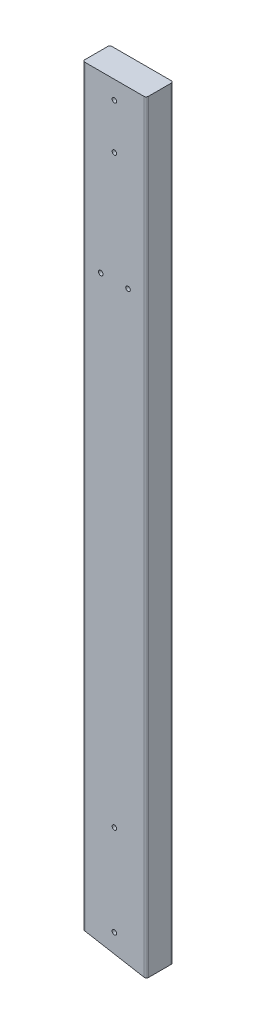
ISO-10303-21;
HEADER;
FILE_DESCRIPTION(('STEP AP214'),'2;1');
FILE_NAME('part.step','',(''),(''),'','','');
FILE_SCHEMA(('AUTOMOTIVE_DESIGN { 1 0 10303 214 1 1 1 1 }'));
ENDSEC;
DATA;
#1=APPLICATION_CONTEXT('core data for automotive mechanical design processes');
#2=APPLICATION_PROTOCOL_DEFINITION('international standard','automotive_design',2000,#1);
#3=PRODUCT_CONTEXT('',#1,'mechanical');
#4=PRODUCT('Part','Part','',(#3));
#5=PRODUCT_RELATED_PRODUCT_CATEGORY('part','',(#4));
#6=PRODUCT_DEFINITION_FORMATION('','',#4);
#7=PRODUCT_DEFINITION_CONTEXT('part definition',#1,'design');
#8=PRODUCT_DEFINITION('design','',#6,#7);
#9=PRODUCT_DEFINITION_SHAPE('','',#8);
#10=(LENGTH_UNIT() NAMED_UNIT(*) SI_UNIT(.MILLI.,.METRE.));
#11=(NAMED_UNIT(*) PLANE_ANGLE_UNIT() SI_UNIT($,.RADIAN.));
#12=(NAMED_UNIT(*) SI_UNIT($,.STERADIAN.) SOLID_ANGLE_UNIT());
#13=UNCERTAINTY_MEASURE_WITH_UNIT(LENGTH_MEASURE(1.E-05),#10,'distance_accuracy_value','');
#14=(GEOMETRIC_REPRESENTATION_CONTEXT(3) GLOBAL_UNCERTAINTY_ASSIGNED_CONTEXT((#13)) GLOBAL_UNIT_ASSIGNED_CONTEXT((#10,
#11,#12)) REPRESENTATION_CONTEXT('',''));
#15=CARTESIAN_POINT('',(0.,0.,0.));
#16=DIRECTION('',(0.,0.,1.));
#17=DIRECTION('',(1.,0.,0.));
#18=AXIS2_PLACEMENT_3D('',#15,#16,#17);
#19=CARTESIAN_POINT('',(-44.45,1068.3875,-19.05));
#20=DIRECTION('',(1.,0.,0.));
#21=DIRECTION('',(0.,0.,-1.));
#22=AXIS2_PLACEMENT_3D('',#19,#20,#21);
#23=PLANE('',#22);
#24=DIRECTION('',(0.,0.,1.));
#25=VECTOR('',#24,1.);
#26=CARTESIAN_POINT('',(-44.45,1068.3875,-19.05));
#27=LINE('',#26,#25);
#28=CARTESIAN_POINT('',(-44.45,1068.3875,-15.875));
#29=VERTEX_POINT('',#28);
#30=CARTESIAN_POINT('',(-44.45,1068.3875,15.875));
#31=VERTEX_POINT('',#30);
#32=EDGE_CURVE('E121',#29,#31,#27,.T.);
#33=ORIENTED_EDGE('',*,*,#32,.F.);
#34=DIRECTION('',(0.,-1.,0.));
#35=VECTOR('',#34,1.);
#36=CARTESIAN_POINT('',(-44.45,1068.3875,-15.875));
#37=LINE('',#36,#35);
#38=CARTESIAN_POINT('',(-44.45,15.6754685849818,-15.8750000000001));
#39=VERTEX_POINT('',#38);
#40=EDGE_CURVE('E106',#29,#39,#37,.T.);
#41=ORIENTED_EDGE('',*,*,#40,.T.);
#42=DIRECTION('',(0.,0.,1.));
#43=VECTOR('',#42,1.);
#44=CARTESIAN_POINT('',(-44.45,15.6754685849818,-1238.5867532));
#45=LINE('',#44,#43);
#46=CARTESIAN_POINT('',(-44.45,15.6754685849818,15.8750000000001));
#47=VERTEX_POINT('',#46);
#48=EDGE_CURVE('E118',#39,#47,#45,.T.);
#49=ORIENTED_EDGE('',*,*,#48,.T.);
#50=DIRECTION('',(0.,-1.,0.));
#51=VECTOR('',#50,1.);
#52=CARTESIAN_POINT('',(-44.45,1068.3875,15.875));
#53=LINE('',#52,#51);
#54=EDGE_CURVE('E123',#47,#31,#53,.F.);
#55=ORIENTED_EDGE('',*,*,#54,.T.);
#56=EDGE_LOOP('',(#33,#41,#49,#55));
#57=FACE_BOUND('',#56,.T.);
#58=ADVANCED_FACE('F37',(#57),#23,.F.);
#59=CARTESIAN_POINT('',(44.45,1068.3875,19.05));
#60=DIRECTION('',(0.,0.,-1.));
#61=DIRECTION('',(-1.,0.,0.));
#62=AXIS2_PLACEMENT_3D('',#59,#60,#61);
#63=PLANE('',#62);
#64=CARTESIAN_POINT('',(0.,34.225276482,19.05));
#65=DIRECTION('',(0.,0.,1.));
#66=DIRECTION('',(1.,0.,0.));
#67=AXIS2_PLACEMENT_3D('',#64,#65,#66);
#68=CIRCLE('',#67,3.17499999999999);
#69=CARTESIAN_POINT('',(3.17499999999999,34.225276482,19.05));
#70=VERTEX_POINT('',#69);
#71=EDGE_CURVE('E369',#70,#70,#68,.T.);
#72=ORIENTED_EDGE('',*,*,#71,.F.);
#73=EDGE_LOOP('',(#72));
#74=FACE_BOUND('',#73,.T.);
#75=CARTESIAN_POINT('',(0.,161.225276482,19.05));
#76=DIRECTION('',(0.,0.,1.));
#77=DIRECTION('',(1.,0.,0.));
#78=AXIS2_PLACEMENT_3D('',#75,#76,#77);
#79=CIRCLE('',#78,3.17499999999999);
#80=CARTESIAN_POINT('',(3.17499999999999,161.225276482,19.05));
#81=VERTEX_POINT('',#80);
#82=EDGE_CURVE('E365',#81,#81,#79,.T.);
#83=ORIENTED_EDGE('',*,*,#82,.F.);
#84=EDGE_LOOP('',(#83));
#85=FACE_BOUND('',#84,.T.);
#86=CARTESIAN_POINT('',(19.05,823.9779812,19.05));
#87=DIRECTION('',(0.,0.,1.));
#88=DIRECTION('',(1.,0.,0.));
#89=AXIS2_PLACEMENT_3D('',#86,#87,#88);
#90=CIRCLE('',#89,3.17499999999999);
#91=CARTESIAN_POINT('',(22.225,823.9779812,19.05));
#92=VERTEX_POINT('',#91);
#93=EDGE_CURVE('E361',#92,#92,#90,.T.);
#94=ORIENTED_EDGE('',*,*,#93,.F.);
#95=EDGE_LOOP('',(#94));
#96=FACE_BOUND('',#95,.T.);
#97=CARTESIAN_POINT('',(-19.05,823.9779812,19.05));
#98=DIRECTION('',(0.,0.,1.));
#99=DIRECTION('',(1.,0.,0.));
#100=AXIS2_PLACEMENT_3D('',#97,#98,#99);
#101=CIRCLE('',#100,3.17499999999999);
#102=CARTESIAN_POINT('',(-15.875,823.9779812,19.05));
#103=VERTEX_POINT('',#102);
#104=EDGE_CURVE('E357',#103,#103,#101,.T.);
#105=ORIENTED_EDGE('',*,*,#104,.F.);
#106=EDGE_LOOP('',(#105));
#107=FACE_BOUND('',#106,.T.);
#108=CARTESIAN_POINT('',(0.,979.4875,19.05));
#109=DIRECTION('',(0.,0.,1.));
#110=DIRECTION('',(1.,0.,0.));
#111=AXIS2_PLACEMENT_3D('',#108,#109,#110);
#112=CIRCLE('',#111,3.17499999999999);
#113=CARTESIAN_POINT('',(3.17499999999999,979.4875,19.05));
#114=VERTEX_POINT('',#113);
#115=EDGE_CURVE('E353',#114,#114,#112,.T.);
#116=ORIENTED_EDGE('',*,*,#115,.F.);
#117=EDGE_LOOP('',(#116));
#118=FACE_BOUND('',#117,.T.);
#119=CARTESIAN_POINT('',(0.,1042.9875,19.05));
#120=DIRECTION('',(0.,0.,1.));
#121=DIRECTION('',(1.,0.,0.));
#122=AXIS2_PLACEMENT_3D('',#119,#120,#121);
#123=CIRCLE('',#122,3.17499999999999);
#124=CARTESIAN_POINT('',(3.17499999999999,1042.9875,19.05));
#125=VERTEX_POINT('',#124);
#126=EDGE_CURVE('E348',#125,#125,#123,.T.);
#127=ORIENTED_EDGE('',*,*,#126,.F.);
#128=EDGE_LOOP('',(#127));
#129=FACE_BOUND('',#128,.T.);
#130=DIRECTION('',(1.,0.,0.));
#131=VECTOR('',#130,1.);
#132=CARTESIAN_POINT('',(44.45,1068.3875,19.05));
#133=LINE('',#132,#131);
#134=CARTESIAN_POINT('',(-41.275,1068.3875,19.05));
#135=VERTEX_POINT('',#134);
#136=CARTESIAN_POINT('',(41.275,1068.3875,19.05));
#137=VERTEX_POINT('',#136);
#138=EDGE_CURVE('E137',#135,#137,#133,.T.);
#139=ORIENTED_EDGE('',*,*,#138,.F.);
#140=DIRECTION('',(0.,-1.,0.));
#141=VECTOR('',#140,1.);
#142=CARTESIAN_POINT('',(-41.275,1068.3875,19.05));
#143=LINE('',#142,#141);
#144=CARTESIAN_POINT('',(-41.275,15.1156304212325,19.05));
#145=VERTEX_POINT('',#144);
#146=EDGE_CURVE('E162',#135,#145,#143,.T.);
#147=ORIENTED_EDGE('',*,*,#146,.T.);
#148=DIRECTION('',(-0.984807753012209,0.173648177666923,0.));
#149=VECTOR('',#148,1.);
#150=CARTESIAN_POINT('',(44.45,0.,19.05));
#151=LINE('',#150,#149);
#152=CARTESIAN_POINT('',(41.275,0.55983816374935,19.05));
#153=VERTEX_POINT('',#152);
#154=EDGE_CURVE('E128',#153,#145,#151,.T.);
#155=ORIENTED_EDGE('',*,*,#154,.F.);
#156=DIRECTION('',(0.,-1.,0.));
#157=VECTOR('',#156,1.);
#158=CARTESIAN_POINT('',(41.275,1068.3875,19.05));
#159=LINE('',#158,#157);
#160=EDGE_CURVE('E160',#153,#137,#159,.F.);
#161=ORIENTED_EDGE('',*,*,#160,.T.);
#162=EDGE_LOOP('',(#139,#147,#155,#161));
#163=FACE_BOUND('',#162,.T.);
#164=ADVANCED_FACE('F184',(#74,#85,#96,#107,#118,#129,#163),#63,.F.);
#165=CARTESIAN_POINT('',(44.45,1068.3875,-19.05));
#166=DIRECTION('',(-1.,0.,0.));
#167=DIRECTION('',(0.,0.,1.));
#168=AXIS2_PLACEMENT_3D('',#165,#166,#167);
#169=PLANE('',#168);
#170=DIRECTION('',(0.,0.,-1.));
#171=VECTOR('',#170,1.);
#172=CARTESIAN_POINT('',(44.45,0.,-19.05));
#173=LINE('',#172,#171);
#174=CARTESIAN_POINT('',(44.45,0.,15.875));
#175=VERTEX_POINT('',#174);
#176=CARTESIAN_POINT('',(44.45,0.,-15.875));
#177=VERTEX_POINT('',#176);
#178=EDGE_CURVE('E130',#175,#177,#173,.T.);
#179=ORIENTED_EDGE('',*,*,#178,.T.);
#180=DIRECTION('',(0.,-1.,0.));
#181=VECTOR('',#180,1.);
#182=CARTESIAN_POINT('',(44.45,1068.3875,-15.875));
#183=LINE('',#182,#181);
#184=CARTESIAN_POINT('',(44.45,1068.3875,-15.875));
#185=VERTEX_POINT('',#184);
#186=EDGE_CURVE('E11',#177,#185,#183,.F.);
#187=ORIENTED_EDGE('',*,*,#186,.T.);
#188=DIRECTION('',(0.,0.,-1.));
#189=VECTOR('',#188,1.);
#190=CARTESIAN_POINT('',(44.45,1068.3875,-19.05));
#191=LINE('',#190,#189);
#192=CARTESIAN_POINT('',(44.45,1068.3875,15.875));
#193=VERTEX_POINT('',#192);
#194=EDGE_CURVE('E139',#193,#185,#191,.T.);
#195=ORIENTED_EDGE('',*,*,#194,.F.);
#196=DIRECTION('',(0.,-1.,0.));
#197=VECTOR('',#196,1.);
#198=CARTESIAN_POINT('',(44.45,1068.3875,15.875));
#199=LINE('',#198,#197);
#200=EDGE_CURVE('E45',#193,#175,#199,.T.);
#201=ORIENTED_EDGE('',*,*,#200,.T.);
#202=EDGE_LOOP('',(#179,#187,#195,#201));
#203=FACE_BOUND('',#202,.T.);
#204=ADVANCED_FACE('F167',(#203),#169,.F.);
#205=CARTESIAN_POINT('',(44.45,1068.3875,-19.05));
#206=DIRECTION('',(0.,0.,1.));
#207=DIRECTION('',(1.,0.,0.));
#208=AXIS2_PLACEMENT_3D('',#205,#206,#207);
#209=PLANE('',#208);
#210=CARTESIAN_POINT('',(0.,34.225276482,-19.05));
#211=DIRECTION('',(0.,0.,1.));
#212=DIRECTION('',(1.,0.,0.));
#213=AXIS2_PLACEMENT_3D('',#210,#211,#212);
#214=CIRCLE('',#213,3.17499999999998);
#215=CARTESIAN_POINT('',(3.17499999999999,34.225276482,-19.05));
#216=VERTEX_POINT('',#215);
#217=EDGE_CURVE('E329',#216,#216,#214,.T.);
#218=ORIENTED_EDGE('',*,*,#217,.T.);
#219=EDGE_LOOP('',(#218));
#220=FACE_BOUND('',#219,.T.);
#221=CARTESIAN_POINT('',(0.,161.225276482,-19.05));
#222=DIRECTION('',(0.,0.,1.));
#223=DIRECTION('',(1.,0.,0.));
#224=AXIS2_PLACEMENT_3D('',#221,#222,#223);
#225=CIRCLE('',#224,3.17499999999998);
#226=CARTESIAN_POINT('',(3.17499999999999,161.225276482,-19.05));
#227=VERTEX_POINT('',#226);
#228=EDGE_CURVE('E333',#227,#227,#225,.T.);
#229=ORIENTED_EDGE('',*,*,#228,.T.);
#230=EDGE_LOOP('',(#229));
#231=FACE_BOUND('',#230,.T.);
#232=CARTESIAN_POINT('',(19.05,823.9779812,-19.05));
#233=DIRECTION('',(0.,0.,1.));
#234=DIRECTION('',(1.,0.,0.));
#235=AXIS2_PLACEMENT_3D('',#232,#233,#234);
#236=CIRCLE('',#235,3.17499999999998);
#237=CARTESIAN_POINT('',(22.225,823.9779812,-19.05));
#238=VERTEX_POINT('',#237);
#239=EDGE_CURVE('E337',#238,#238,#236,.T.);
#240=ORIENTED_EDGE('',*,*,#239,.T.);
#241=EDGE_LOOP('',(#240));
#242=FACE_BOUND('',#241,.T.);
#243=CARTESIAN_POINT('',(-19.05,823.9779812,-19.05));
#244=DIRECTION('',(0.,0.,1.));
#245=DIRECTION('',(1.,0.,0.));
#246=AXIS2_PLACEMENT_3D('',#243,#244,#245);
#247=CIRCLE('',#246,3.17499999999998);
#248=CARTESIAN_POINT('',(-15.875,823.9779812,-19.05));
#249=VERTEX_POINT('',#248);
#250=EDGE_CURVE('E341',#249,#249,#247,.T.);
#251=ORIENTED_EDGE('',*,*,#250,.T.);
#252=EDGE_LOOP('',(#251));
#253=FACE_BOUND('',#252,.T.);
#254=CARTESIAN_POINT('',(0.,979.4875,-19.05));
#255=DIRECTION('',(0.,0.,1.));
#256=DIRECTION('',(1.,0.,0.));
#257=AXIS2_PLACEMENT_3D('',#254,#255,#256);
#258=CIRCLE('',#257,3.17499999999998);
#259=CARTESIAN_POINT('',(3.17499999999999,979.4875,-19.05));
#260=VERTEX_POINT('',#259);
#261=EDGE_CURVE('E345',#260,#260,#258,.T.);
#262=ORIENTED_EDGE('',*,*,#261,.T.);
#263=EDGE_LOOP('',(#262));
#264=FACE_BOUND('',#263,.T.);
#265=CARTESIAN_POINT('',(0.,1042.9875,-19.05));
#266=DIRECTION('',(0.,0.,1.));
#267=DIRECTION('',(1.,0.,0.));
#268=AXIS2_PLACEMENT_3D('',#265,#266,#267);
#269=CIRCLE('',#268,3.17499999999998);
#270=CARTESIAN_POINT('',(3.17499999999999,1042.9875,-19.05));
#271=VERTEX_POINT('',#270);
#272=EDGE_CURVE('E132',#271,#271,#269,.T.);
#273=ORIENTED_EDGE('',*,*,#272,.T.);
#274=EDGE_LOOP('',(#273));
#275=FACE_BOUND('',#274,.T.);
#276=DIRECTION('',(-0.984807753012209,0.173648177666923,0.));
#277=VECTOR('',#276,1.);
#278=CARTESIAN_POINT('',(-138.255022938669,32.2158250550446,-19.05));
#279=LINE('',#278,#277);
#280=CARTESIAN_POINT('',(41.275,0.559838163749188,-19.05));
#281=VERTEX_POINT('',#280);
#282=CARTESIAN_POINT('',(-41.275,15.1156304212323,-19.05));
#283=VERTEX_POINT('',#282);
#284=EDGE_CURVE('E127',#281,#283,#279,.T.);
#285=ORIENTED_EDGE('',*,*,#284,.T.);
#286=DIRECTION('',(0.,-1.,0.));
#287=VECTOR('',#286,1.);
#288=CARTESIAN_POINT('',(-41.275,1068.3875,-19.05));
#289=LINE('',#288,#287);
#290=CARTESIAN_POINT('',(-41.275,1068.3875,-19.05));
#291=VERTEX_POINT('',#290);
#292=EDGE_CURVE('E107',#283,#291,#289,.F.);
#293=ORIENTED_EDGE('',*,*,#292,.T.);
#294=DIRECTION('',(-1.,0.,0.));
#295=VECTOR('',#294,1.);
#296=CARTESIAN_POINT('',(44.45,1068.3875,-19.05));
#297=LINE('',#296,#295);
#298=CARTESIAN_POINT('',(41.275,1068.3875,-19.05));
#299=VERTEX_POINT('',#298);
#300=EDGE_CURVE('E141',#299,#291,#297,.T.);
#301=ORIENTED_EDGE('',*,*,#300,.F.);
#302=DIRECTION('',(0.,-1.,0.));
#303=VECTOR('',#302,1.);
#304=CARTESIAN_POINT('',(41.275,1068.3875,-19.05));
#305=LINE('',#304,#303);
#306=EDGE_CURVE('E112',#299,#281,#305,.T.);
#307=ORIENTED_EDGE('',*,*,#306,.T.);
#308=EDGE_LOOP('',(#285,#293,#301,#307));
#309=FACE_BOUND('',#308,.T.);
#310=ADVANCED_FACE('F176',(#220,#231,#242,#253,#264,#275,#309),#209,.F.);
#311=CARTESIAN_POINT('',(0.,1068.3875,0.));
#312=DIRECTION('',(0.,-1.,0.));
#313=DIRECTION('',(0.,0.,-1.));
#314=AXIS2_PLACEMENT_3D('',#311,#312,#313);
#315=PLANE('',#314);
#316=ORIENTED_EDGE('',*,*,#300,.T.);
#317=CARTESIAN_POINT('',(-41.275,1068.3875,-15.875));
#318=DIRECTION('',(0.,-1.,0.));
#319=DIRECTION('',(0.,0.,-1.));
#320=AXIS2_PLACEMENT_3D('',#317,#318,#319);
#321=CIRCLE('',#320,3.175);
#322=EDGE_CURVE('E158',#291,#29,#321,.F.);
#323=ORIENTED_EDGE('',*,*,#322,.T.);
#324=ORIENTED_EDGE('',*,*,#32,.T.);
#325=CARTESIAN_POINT('',(-41.275,1068.3875,15.875));
#326=DIRECTION('',(0.,-1.,0.));
#327=DIRECTION('',(0.,0.,-1.));
#328=AXIS2_PLACEMENT_3D('',#325,#326,#327);
#329=CIRCLE('',#328,3.175);
#330=EDGE_CURVE('E156',#31,#135,#329,.F.);
#331=ORIENTED_EDGE('',*,*,#330,.T.);
#332=ORIENTED_EDGE('',*,*,#138,.T.);
#333=CARTESIAN_POINT('',(41.275,1068.3875,15.875));
#334=DIRECTION('',(0.,-1.,0.));
#335=DIRECTION('',(0.,0.,-1.));
#336=AXIS2_PLACEMENT_3D('',#333,#334,#335);
#337=CIRCLE('',#336,3.175);
#338=EDGE_CURVE('E57',#137,#193,#337,.F.);
#339=ORIENTED_EDGE('',*,*,#338,.T.);
#340=ORIENTED_EDGE('',*,*,#194,.T.);
#341=CARTESIAN_POINT('',(41.275,1068.3875,-15.875));
#342=DIRECTION('',(0.,-1.,0.));
#343=DIRECTION('',(0.,0.,-1.));
#344=AXIS2_PLACEMENT_3D('',#341,#342,#343);
#345=CIRCLE('',#344,3.175);
#346=EDGE_CURVE('E154',#185,#299,#345,.F.);
#347=ORIENTED_EDGE('',*,*,#346,.T.);
#348=EDGE_LOOP('',(#316,#323,#324,#331,#332,#339,#340,#347));
#349=FACE_BOUND('',#348,.T.);
#350=ADVANCED_FACE('F177',(#349),#315,.F.);
#351=CARTESIAN_POINT('',(44.45,0.,-1238.5867532));
#352=DIRECTION('',(0.173648177666923,0.984807753012209,0.));
#353=DIRECTION('',(-0.984807753012209,0.173648177666923,0.));
#354=AXIS2_PLACEMENT_3D('',#351,#352,#353);
#355=PLANE('',#354);
#356=ORIENTED_EDGE('',*,*,#48,.F.);
#357=CARTESIAN_POINT('',(-41.275,15.1156304212325,-15.875));
#358=DIRECTION('',(0.173648177666923,0.984807753012209,0.));
#359=DIRECTION('',(0.984807753012209,-0.173648177666923,0.));
#360=AXIS2_PLACEMENT_3D('',#357,#358,#359);
#361=ELLIPSE('',#360,3.22397949273724,3.175);
#362=EDGE_CURVE('E102',#39,#283,#361,.F.);
#363=ORIENTED_EDGE('',*,*,#362,.T.);
#364=ORIENTED_EDGE('',*,*,#284,.F.);
#365=CARTESIAN_POINT('',(41.275,0.559838163749271,-15.875));
#366=DIRECTION('',(0.173648177666923,0.984807753012209,0.));
#367=DIRECTION('',(0.984807753012209,-0.173648177666923,0.));
#368=AXIS2_PLACEMENT_3D('',#365,#366,#367);
#369=ELLIPSE('',#368,3.22397949273724,3.175);
#370=EDGE_CURVE('E147',#281,#177,#369,.F.);
#371=ORIENTED_EDGE('',*,*,#370,.T.);
#372=ORIENTED_EDGE('',*,*,#178,.F.);
#373=CARTESIAN_POINT('',(41.275,0.559838163749271,15.875));
#374=DIRECTION('',(0.173648177666923,0.984807753012209,0.));
#375=DIRECTION('',(0.984807753012209,-0.173648177666923,0.));
#376=AXIS2_PLACEMENT_3D('',#373,#374,#375);
#377=ELLIPSE('',#376,3.22397949273724,3.175);
#378=EDGE_CURVE('E122',#175,#153,#377,.F.);
#379=ORIENTED_EDGE('',*,*,#378,.T.);
#380=ORIENTED_EDGE('',*,*,#154,.T.);
#381=CARTESIAN_POINT('',(-41.275,15.1156304212325,15.875));
#382=DIRECTION('',(0.173648177666923,0.984807753012209,0.));
#383=DIRECTION('',(0.984807753012209,-0.173648177666923,0.));
#384=AXIS2_PLACEMENT_3D('',#381,#382,#383);
#385=ELLIPSE('',#384,3.22397949273724,3.175);
#386=EDGE_CURVE('E113',#145,#47,#385,.F.);
#387=ORIENTED_EDGE('',*,*,#386,.T.);
#388=EDGE_LOOP('',(#356,#363,#364,#371,#372,#379,#380,#387));
#389=FACE_BOUND('',#388,.T.);
#390=ADVANCED_FACE('F125',(#389),#355,.F.);
#391=CARTESIAN_POINT('',(0.,1042.9875,19.05));
#392=DIRECTION('',(0.,0.,1.));
#393=DIRECTION('',(1.,0.,0.));
#394=AXIS2_PLACEMENT_3D('',#391,#392,#393);
#395=CYLINDRICAL_SURFACE('',#394,3.17499999999999);
#396=ORIENTED_EDGE('',*,*,#272,.F.);
#397=EDGE_LOOP('',(#396));
#398=FACE_BOUND('',#397,.T.);
#399=ORIENTED_EDGE('',*,*,#126,.T.);
#400=EDGE_LOOP('',(#399));
#401=FACE_BOUND('',#400,.T.);
#402=ADVANCED_FACE('F268',(#398,#401),#395,.F.);
#403=CARTESIAN_POINT('',(0.,979.4875,19.05));
#404=DIRECTION('',(0.,0.,1.));
#405=DIRECTION('',(1.,0.,0.));
#406=AXIS2_PLACEMENT_3D('',#403,#404,#405);
#407=CYLINDRICAL_SURFACE('',#406,3.17499999999999);
#408=ORIENTED_EDGE('',*,*,#261,.F.);
#409=EDGE_LOOP('',(#408));
#410=FACE_BOUND('',#409,.T.);
#411=ORIENTED_EDGE('',*,*,#115,.T.);
#412=EDGE_LOOP('',(#411));
#413=FACE_BOUND('',#412,.T.);
#414=ADVANCED_FACE('F259',(#410,#413),#407,.F.);
#415=CARTESIAN_POINT('',(-19.05,823.9779812,19.05));
#416=DIRECTION('',(0.,0.,1.));
#417=DIRECTION('',(1.,0.,0.));
#418=AXIS2_PLACEMENT_3D('',#415,#416,#417);
#419=CYLINDRICAL_SURFACE('',#418,3.17499999999999);
#420=ORIENTED_EDGE('',*,*,#250,.F.);
#421=EDGE_LOOP('',(#420));
#422=FACE_BOUND('',#421,.T.);
#423=ORIENTED_EDGE('',*,*,#104,.T.);
#424=EDGE_LOOP('',(#423));
#425=FACE_BOUND('',#424,.T.);
#426=ADVANCED_FACE('F250',(#422,#425),#419,.F.);
#427=CARTESIAN_POINT('',(19.05,823.9779812,19.05));
#428=DIRECTION('',(0.,0.,1.));
#429=DIRECTION('',(1.,0.,0.));
#430=AXIS2_PLACEMENT_3D('',#427,#428,#429);
#431=CYLINDRICAL_SURFACE('',#430,3.17499999999999);
#432=ORIENTED_EDGE('',*,*,#239,.F.);
#433=EDGE_LOOP('',(#432));
#434=FACE_BOUND('',#433,.T.);
#435=ORIENTED_EDGE('',*,*,#93,.T.);
#436=EDGE_LOOP('',(#435));
#437=FACE_BOUND('',#436,.T.);
#438=ADVANCED_FACE('F241',(#434,#437),#431,.F.);
#439=CARTESIAN_POINT('',(0.,161.225276482,19.05));
#440=DIRECTION('',(0.,0.,1.));
#441=DIRECTION('',(1.,0.,0.));
#442=AXIS2_PLACEMENT_3D('',#439,#440,#441);
#443=CYLINDRICAL_SURFACE('',#442,3.17499999999999);
#444=ORIENTED_EDGE('',*,*,#228,.F.);
#445=EDGE_LOOP('',(#444));
#446=FACE_BOUND('',#445,.T.);
#447=ORIENTED_EDGE('',*,*,#82,.T.);
#448=EDGE_LOOP('',(#447));
#449=FACE_BOUND('',#448,.T.);
#450=ADVANCED_FACE('F232',(#446,#449),#443,.F.);
#451=CARTESIAN_POINT('',(0.,34.225276482,19.05));
#452=DIRECTION('',(0.,0.,1.));
#453=DIRECTION('',(1.,0.,0.));
#454=AXIS2_PLACEMENT_3D('',#451,#452,#453);
#455=CYLINDRICAL_SURFACE('',#454,3.17499999999999);
#456=ORIENTED_EDGE('',*,*,#217,.F.);
#457=EDGE_LOOP('',(#456));
#458=FACE_BOUND('',#457,.T.);
#459=ORIENTED_EDGE('',*,*,#71,.T.);
#460=EDGE_LOOP('',(#459));
#461=FACE_BOUND('',#460,.T.);
#462=ADVANCED_FACE('F201',(#458,#461),#455,.F.);
#463=CARTESIAN_POINT('',(-41.275,1068.3875,-15.875));
#464=DIRECTION('',(0.,-1.,0.));
#465=DIRECTION('',(0.,0.,-1.));
#466=AXIS2_PLACEMENT_3D('',#463,#464,#465);
#467=CYLINDRICAL_SURFACE('',#466,3.175);
#468=ORIENTED_EDGE('',*,*,#322,.F.);
#469=ORIENTED_EDGE('',*,*,#292,.F.);
#470=ORIENTED_EDGE('',*,*,#362,.F.);
#471=ORIENTED_EDGE('',*,*,#40,.F.);
#472=EDGE_LOOP('',(#468,#469,#470,#471));
#473=FACE_BOUND('',#472,.T.);
#474=ADVANCED_FACE('F105',(#473),#467,.T.);
#475=CARTESIAN_POINT('',(-41.275,1068.3875,15.875));
#476=DIRECTION('',(0.,-1.,0.));
#477=DIRECTION('',(0.,0.,-1.));
#478=AXIS2_PLACEMENT_3D('',#475,#476,#477);
#479=CYLINDRICAL_SURFACE('',#478,3.175);
#480=ORIENTED_EDGE('',*,*,#330,.F.);
#481=ORIENTED_EDGE('',*,*,#54,.F.);
#482=ORIENTED_EDGE('',*,*,#386,.F.);
#483=ORIENTED_EDGE('',*,*,#146,.F.);
#484=EDGE_LOOP('',(#480,#481,#482,#483));
#485=FACE_BOUND('',#484,.T.);
#486=ADVANCED_FACE('F182',(#485),#479,.T.);
#487=CARTESIAN_POINT('',(41.275,1068.3875,-15.875));
#488=DIRECTION('',(0.,-1.,0.));
#489=DIRECTION('',(0.,0.,-1.));
#490=AXIS2_PLACEMENT_3D('',#487,#488,#489);
#491=CYLINDRICAL_SURFACE('',#490,3.175);
#492=ORIENTED_EDGE('',*,*,#346,.F.);
#493=ORIENTED_EDGE('',*,*,#186,.F.);
#494=ORIENTED_EDGE('',*,*,#370,.F.);
#495=ORIENTED_EDGE('',*,*,#306,.F.);
#496=EDGE_LOOP('',(#492,#493,#494,#495));
#497=FACE_BOUND('',#496,.T.);
#498=ADVANCED_FACE('F173',(#497),#491,.T.);
#499=CARTESIAN_POINT('',(41.275,1068.3875,15.875));
#500=DIRECTION('',(0.,-1.,0.));
#501=DIRECTION('',(0.,0.,-1.));
#502=AXIS2_PLACEMENT_3D('',#499,#500,#501);
#503=CYLINDRICAL_SURFACE('',#502,3.175);
#504=ORIENTED_EDGE('',*,*,#338,.F.);
#505=ORIENTED_EDGE('',*,*,#160,.F.);
#506=ORIENTED_EDGE('',*,*,#378,.F.);
#507=ORIENTED_EDGE('',*,*,#200,.F.);
#508=EDGE_LOOP('',(#504,#505,#506,#507));
#509=FACE_BOUND('',#508,.T.);
#510=ADVANCED_FACE('F39',(#509),#503,.T.);
#511=CLOSED_SHELL('',(#58,#164,#204,#310,#350,#390,#402,#414,#426,#438,#450,#462,#474,#486,#498,#510));
#512=MANIFOLD_SOLID_BREP('B2',#511);
#513=ADVANCED_BREP_SHAPE_REPRESENTATION('',(#18,#512),#14);
#514=SHAPE_DEFINITION_REPRESENTATION(#9,#513);
ENDSEC;
END-ISO-10303-21;
